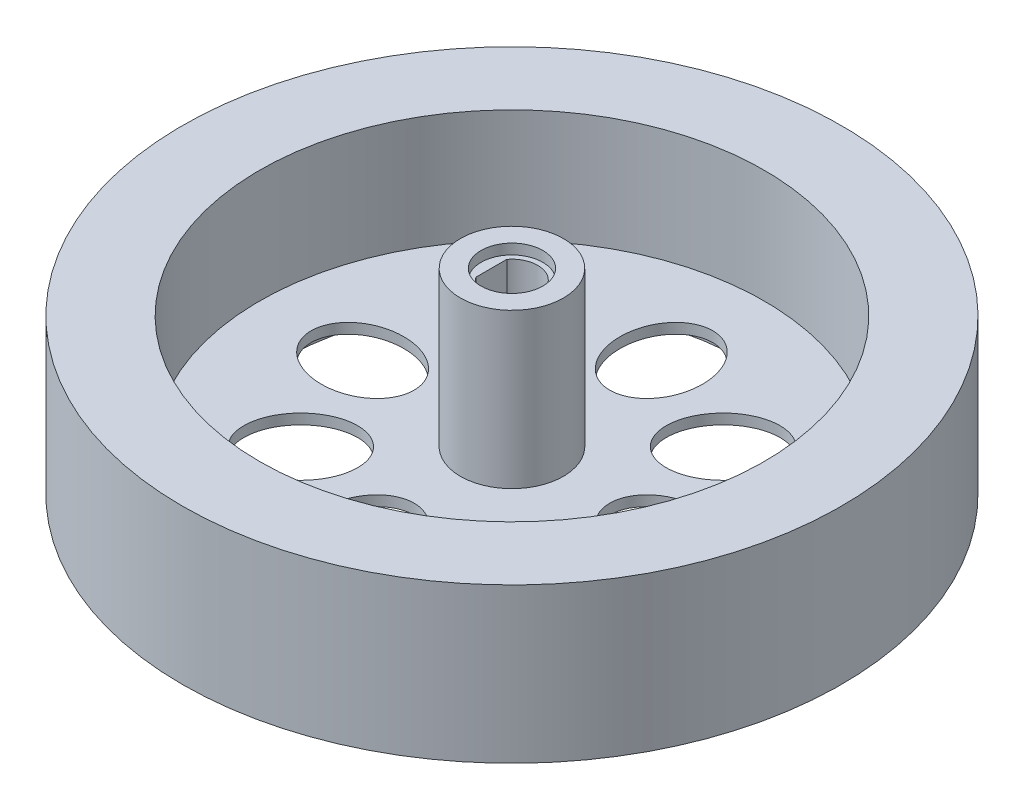
ISO-10303-21;
HEADER;
FILE_DESCRIPTION(('STEP AP214'),'2;1');
FILE_NAME('part.step','',(''),(''),'','','');
FILE_SCHEMA(('AUTOMOTIVE_DESIGN { 1 0 10303 214 1 1 1 1 }'));
ENDSEC;
DATA;
#1=APPLICATION_CONTEXT('core data for automotive mechanical design processes');
#2=APPLICATION_PROTOCOL_DEFINITION('international standard','automotive_design',2000,#1);
#3=PRODUCT_CONTEXT('',#1,'mechanical');
#4=PRODUCT('Part','Part','',(#3));
#5=PRODUCT_RELATED_PRODUCT_CATEGORY('part','',(#4));
#6=PRODUCT_DEFINITION_FORMATION('','',#4);
#7=PRODUCT_DEFINITION_CONTEXT('part definition',#1,'design');
#8=PRODUCT_DEFINITION('design','',#6,#7);
#9=PRODUCT_DEFINITION_SHAPE('','',#8);
#10=(LENGTH_UNIT() NAMED_UNIT(*) SI_UNIT(.MILLI.,.METRE.));
#11=(NAMED_UNIT(*) PLANE_ANGLE_UNIT() SI_UNIT($,.RADIAN.));
#12=(NAMED_UNIT(*) SI_UNIT($,.STERADIAN.) SOLID_ANGLE_UNIT());
#13=UNCERTAINTY_MEASURE_WITH_UNIT(LENGTH_MEASURE(1.E-05),#10,'distance_accuracy_value','');
#14=(GEOMETRIC_REPRESENTATION_CONTEXT(3) GLOBAL_UNCERTAINTY_ASSIGNED_CONTEXT((#13)) GLOBAL_UNIT_ASSIGNED_CONTEXT((#10,
#11,#12)) REPRESENTATION_CONTEXT('',''));
#15=CARTESIAN_POINT('',(0.,0.,0.));
#16=DIRECTION('',(0.,0.,1.));
#17=DIRECTION('',(1.,0.,0.));
#18=AXIS2_PLACEMENT_3D('',#15,#16,#17);
#19=CARTESIAN_POINT('',(0.,15.,0.));
#20=DIRECTION('',(0.,-1.,0.));
#21=DIRECTION('',(0.,0.,-1.));
#22=AXIS2_PLACEMENT_3D('',#19,#20,#21);
#23=CYLINDRICAL_SURFACE('',#22,32.);
#24=CARTESIAN_POINT('',(0.,15.,0.));
#25=DIRECTION('',(0.,1.,0.));
#26=DIRECTION('',(0.,0.,1.));
#27=AXIS2_PLACEMENT_3D('',#24,#25,#26);
#28=CIRCLE('',#27,32.);
#29=CARTESIAN_POINT('',(0.,15.,32.));
#30=VERTEX_POINT('',#29);
#31=EDGE_CURVE('E11',#30,#30,#28,.T.);
#32=ORIENTED_EDGE('',*,*,#31,.F.);
#33=EDGE_LOOP('',(#32));
#34=FACE_BOUND('',#33,.T.);
#35=CARTESIAN_POINT('',(0.,0.,0.));
#36=DIRECTION('',(0.,1.,0.));
#37=DIRECTION('',(0.,0.,1.));
#38=AXIS2_PLACEMENT_3D('',#35,#36,#37);
#39=CIRCLE('',#38,32.);
#40=CARTESIAN_POINT('',(0.,0.,32.));
#41=VERTEX_POINT('',#40);
#42=EDGE_CURVE('E38',#41,#41,#39,.T.);
#43=ORIENTED_EDGE('',*,*,#42,.T.);
#44=EDGE_LOOP('',(#43));
#45=FACE_BOUND('',#44,.T.);
#46=ADVANCED_FACE('F35',(#34,#45),#23,.T.);
#47=CARTESIAN_POINT('',(0.,15.,0.));
#48=DIRECTION('',(0.,1.,0.));
#49=DIRECTION('',(0.,0.,1.));
#50=AXIS2_PLACEMENT_3D('',#47,#48,#49);
#51=PLANE('',#50);
#52=CARTESIAN_POINT('',(0.,15.,0.));
#53=DIRECTION('',(0.,1.,0.));
#54=DIRECTION('',(0.,0.,1.));
#55=AXIS2_PLACEMENT_3D('',#52,#53,#54);
#56=CIRCLE('',#55,24.5);
#57=CARTESIAN_POINT('',(0.,15.,24.5));
#58=VERTEX_POINT('',#57);
#59=EDGE_CURVE('E216',#58,#58,#56,.T.);
#60=ORIENTED_EDGE('',*,*,#59,.F.);
#61=EDGE_LOOP('',(#60));
#62=FACE_BOUND('',#61,.T.);
#63=ORIENTED_EDGE('',*,*,#31,.T.);
#64=EDGE_LOOP('',(#63));
#65=FACE_BOUND('',#64,.T.);
#66=ADVANCED_FACE('F242',(#62,#65),#51,.T.);
#67=CARTESIAN_POINT('',(0.,0.,0.));
#68=DIRECTION('',(0.,1.,0.));
#69=DIRECTION('',(0.,0.,1.));
#70=AXIS2_PLACEMENT_3D('',#67,#68,#69);
#71=PLANE('',#70);
#72=CARTESIAN_POINT('',(0.,0.,0.));
#73=DIRECTION('',(0.,-1.,0.));
#74=DIRECTION('',(0.,0.,-1.));
#75=AXIS2_PLACEMENT_3D('',#72,#73,#74);
#76=CIRCLE('',#75,22.5);
#77=CARTESIAN_POINT('',(0.,0.,-22.5));
#78=VERTEX_POINT('',#77);
#79=EDGE_CURVE('E228',#78,#78,#76,.T.);
#80=ORIENTED_EDGE('',*,*,#79,.F.);
#81=EDGE_LOOP('',(#80));
#82=FACE_BOUND('',#81,.T.);
#83=ORIENTED_EDGE('',*,*,#42,.F.);
#84=EDGE_LOOP('',(#83));
#85=FACE_BOUND('',#84,.T.);
#86=ADVANCED_FACE('F239',(#82,#85),#71,.F.);
#87=CARTESIAN_POINT('',(0.,3.,0.));
#88=DIRECTION('',(0.,-1.,0.));
#89=DIRECTION('',(0.,0.,-1.));
#90=AXIS2_PLACEMENT_3D('',#87,#88,#89);
#91=CYLINDRICAL_SURFACE('',#90,22.5);
#92=CARTESIAN_POINT('',(0.,3.,0.));
#93=DIRECTION('',(0.,-1.,0.));
#94=DIRECTION('',(0.,0.,-1.));
#95=AXIS2_PLACEMENT_3D('',#92,#93,#94);
#96=CIRCLE('',#95,22.5);
#97=CARTESIAN_POINT('',(0.,3.,-22.5));
#98=VERTEX_POINT('',#97);
#99=EDGE_CURVE('E231',#98,#98,#96,.T.);
#100=ORIENTED_EDGE('',*,*,#99,.F.);
#101=EDGE_LOOP('',(#100));
#102=FACE_BOUND('',#101,.T.);
#103=ORIENTED_EDGE('',*,*,#79,.T.);
#104=EDGE_LOOP('',(#103));
#105=FACE_BOUND('',#104,.T.);
#106=ADVANCED_FACE('F237',(#102,#105),#91,.F.);
#107=CARTESIAN_POINT('',(0.,3.,0.));
#108=DIRECTION('',(0.,-1.,0.));
#109=DIRECTION('',(0.,0.,-1.));
#110=AXIS2_PLACEMENT_3D('',#107,#108,#109);
#111=PLANE('',#110);
#112=CARTESIAN_POINT('',(10.2530483272048,3.,10.2530483272051));
#113=DIRECTION('',(0.,1.,0.));
#114=DIRECTION('',(0.707106781186539,0.,0.707106781186556));
#115=AXIS2_PLACEMENT_3D('',#112,#113,#114);
#116=ELLIPSE('',#115,5.,4.);
#117=CARTESIAN_POINT('',(13.7885822331375,3.,13.7885822331378));
#118=VERTEX_POINT('',#117);
#119=EDGE_CURVE('E209',#118,#118,#116,.F.);
#120=ORIENTED_EDGE('',*,*,#119,.F.);
#121=EDGE_LOOP('',(#120));
#122=FACE_BOUND('',#121,.T.);
#123=CARTESIAN_POINT('',(14.5,3.,1.53693790834952E-13));
#124=DIRECTION('',(0.,1.,0.));
#125=DIRECTION('',(1.,0.,0.));
#126=AXIS2_PLACEMENT_3D('',#123,#124,#125);
#127=ELLIPSE('',#126,5.,4.);
#128=CARTESIAN_POINT('',(19.5,3.,2.06678334317172E-13));
#129=VERTEX_POINT('',#128);
#130=EDGE_CURVE('E206',#129,#129,#127,.F.);
#131=ORIENTED_EDGE('',*,*,#130,.F.);
#132=EDGE_LOOP('',(#131));
#133=FACE_BOUND('',#132,.T.);
#134=CARTESIAN_POINT('',(10.253048327205,3.,-10.2530483272049));
#135=DIRECTION('',(0.,1.,0.));
#136=DIRECTION('',(0.707106781186554,0.,-0.707106781186541));
#137=AXIS2_PLACEMENT_3D('',#134,#135,#136);
#138=ELLIPSE('',#137,5.,4.);
#139=CARTESIAN_POINT('',(13.7885822331378,3.,-13.7885822331376));
#140=VERTEX_POINT('',#139);
#141=EDGE_CURVE('E203',#140,#140,#138,.F.);
#142=ORIENTED_EDGE('',*,*,#141,.F.);
#143=EDGE_LOOP('',(#142));
#144=FACE_BOUND('',#143,.T.);
#145=CARTESIAN_POINT('',(1.03067311421726E-13,3.,-14.5));
#146=DIRECTION('',(0.,1.,0.));
#147=DIRECTION('',(0.,0.,-1.));
#148=AXIS2_PLACEMENT_3D('',#145,#146,#147);
#149=ELLIPSE('',#148,5.,4.);
#150=CARTESIAN_POINT('',(1.38594448209731E-13,3.,-19.5));
#151=VERTEX_POINT('',#150);
#152=EDGE_CURVE('E200',#151,#151,#149,.F.);
#153=ORIENTED_EDGE('',*,*,#152,.F.);
#154=EDGE_LOOP('',(#153));
#155=FACE_BOUND('',#154,.T.);
#156=CARTESIAN_POINT('',(-10.2530483272049,3.,-10.253048327205));
#157=DIRECTION('',(0.,1.,0.));
#158=DIRECTION('',(-0.707106781186544,0.,-0.707106781186551));
#159=AXIS2_PLACEMENT_3D('',#156,#157,#158);
#160=ELLIPSE('',#159,5.,4.);
#161=CARTESIAN_POINT('',(-13.7885822331376,3.,-13.7885822331377));
#162=VERTEX_POINT('',#161);
#163=EDGE_CURVE('E197',#162,#162,#160,.F.);
#164=ORIENTED_EDGE('',*,*,#163,.F.);
#165=EDGE_LOOP('',(#164));
#166=FACE_BOUND('',#165,.T.);
#167=CARTESIAN_POINT('',(-14.5,3.,0.));
#168=DIRECTION('',(0.,1.,0.));
#169=DIRECTION('',(-1.,0.,0.));
#170=AXIS2_PLACEMENT_3D('',#167,#168,#169);
#171=ELLIPSE('',#170,5.,4.);
#172=CARTESIAN_POINT('',(-19.5,3.,0.));
#173=VERTEX_POINT('',#172);
#174=EDGE_CURVE('E194',#173,#173,#171,.F.);
#175=ORIENTED_EDGE('',*,*,#174,.F.);
#176=EDGE_LOOP('',(#175));
#177=FACE_BOUND('',#176,.T.);
#178=CARTESIAN_POINT('',(-10.253048327205,3.,10.2530483272049));
#179=DIRECTION('',(0.,1.,0.));
#180=DIRECTION('',(-0.707106781186549,0.,0.707106781186546));
#181=AXIS2_PLACEMENT_3D('',#178,#179,#180);
#182=ELLIPSE('',#181,5.,4.);
#183=CARTESIAN_POINT('',(-13.7885822331377,3.,13.7885822331377));
#184=VERTEX_POINT('',#183);
#185=EDGE_CURVE('E191',#184,#184,#182,.F.);
#186=ORIENTED_EDGE('',*,*,#185,.F.);
#187=EDGE_LOOP('',(#186));
#188=FACE_BOUND('',#187,.T.);
#189=CARTESIAN_POINT('',(0.,3.,14.5));
#190=DIRECTION('',(0.,1.,0.));
#191=DIRECTION('',(0.,0.,1.));
#192=AXIS2_PLACEMENT_3D('',#189,#190,#191);
#193=ELLIPSE('',#192,5.,4.);
#194=CARTESIAN_POINT('',(0.,3.,19.5));
#195=VERTEX_POINT('',#194);
#196=EDGE_CURVE('E188',#195,#195,#193,.F.);
#197=ORIENTED_EDGE('',*,*,#196,.F.);
#198=EDGE_LOOP('',(#197));
#199=FACE_BOUND('',#198,.T.);
#200=CARTESIAN_POINT('',(0.,3.,0.));
#201=DIRECTION('',(0.,-1.,0.));
#202=DIRECTION('',(0.,0.,-1.));
#203=AXIS2_PLACEMENT_3D('',#200,#201,#202);
#204=CIRCLE('',#203,7.5);
#205=CARTESIAN_POINT('',(0.,3.,-7.5));
#206=VERTEX_POINT('',#205);
#207=EDGE_CURVE('E222',#206,#206,#204,.T.);
#208=ORIENTED_EDGE('',*,*,#207,.F.);
#209=EDGE_LOOP('',(#208));
#210=FACE_BOUND('',#209,.T.);
#211=ORIENTED_EDGE('',*,*,#99,.T.);
#212=EDGE_LOOP('',(#211));
#213=FACE_BOUND('',#212,.T.);
#214=ADVANCED_FACE('F261',(#122,#133,#144,#155,#166,#177,#188,#199,#210,#213),#111,.T.);
#215=CARTESIAN_POINT('',(0.,1.,0.));
#216=DIRECTION('',(0.,1.,0.));
#217=DIRECTION('',(0.,0.,1.));
#218=AXIS2_PLACEMENT_3D('',#215,#216,#217);
#219=CYLINDRICAL_SURFACE('',#218,7.5);
#220=CARTESIAN_POINT('',(0.,1.,0.));
#221=DIRECTION('',(0.,-1.,0.));
#222=DIRECTION('',(0.,0.,-1.));
#223=AXIS2_PLACEMENT_3D('',#220,#221,#222);
#224=CIRCLE('',#223,7.5);
#225=CARTESIAN_POINT('',(0.,1.,-7.5));
#226=VERTEX_POINT('',#225);
#227=EDGE_CURVE('E225',#226,#226,#224,.T.);
#228=ORIENTED_EDGE('',*,*,#227,.F.);
#229=EDGE_LOOP('',(#228));
#230=FACE_BOUND('',#229,.T.);
#231=ORIENTED_EDGE('',*,*,#207,.T.);
#232=EDGE_LOOP('',(#231));
#233=FACE_BOUND('',#232,.T.);
#234=ADVANCED_FACE('F265',(#230,#233),#219,.T.);
#235=CARTESIAN_POINT('',(0.,1.,0.));
#236=DIRECTION('',(0.,-1.,0.));
#237=DIRECTION('',(0.,0.,-1.));
#238=AXIS2_PLACEMENT_3D('',#235,#236,#237);
#239=PLANE('',#238);
#240=ORIENTED_EDGE('',*,*,#227,.T.);
#241=EDGE_LOOP('',(#240));
#242=FACE_BOUND('',#241,.T.);
#243=ADVANCED_FACE('F269',(#242),#239,.T.);
#244=CARTESIAN_POINT('',(0.,4.,0.));
#245=DIRECTION('',(0.,1.,0.));
#246=DIRECTION('',(0.,0.,1.));
#247=AXIS2_PLACEMENT_3D('',#244,#245,#246);
#248=CYLINDRICAL_SURFACE('',#247,24.5);
#249=CARTESIAN_POINT('',(0.,4.,0.));
#250=DIRECTION('',(0.,1.,0.));
#251=DIRECTION('',(0.,0.,1.));
#252=AXIS2_PLACEMENT_3D('',#249,#250,#251);
#253=CIRCLE('',#252,24.5);
#254=CARTESIAN_POINT('',(0.,4.,24.5));
#255=VERTEX_POINT('',#254);
#256=EDGE_CURVE('E219',#255,#255,#253,.T.);
#257=ORIENTED_EDGE('',*,*,#256,.F.);
#258=EDGE_LOOP('',(#257));
#259=FACE_BOUND('',#258,.T.);
#260=ORIENTED_EDGE('',*,*,#59,.T.);
#261=EDGE_LOOP('',(#260));
#262=FACE_BOUND('',#261,.T.);
#263=ADVANCED_FACE('F273',(#259,#262),#248,.F.);
#264=CARTESIAN_POINT('',(0.,4.,0.));
#265=DIRECTION('',(0.,1.,0.));
#266=DIRECTION('',(0.,0.,1.));
#267=AXIS2_PLACEMENT_3D('',#264,#265,#266);
#268=PLANE('',#267);
#269=CARTESIAN_POINT('',(10.2530483272048,4.,10.2530483272051));
#270=DIRECTION('',(0.,1.,0.));
#271=DIRECTION('',(0.707106781186539,0.,0.707106781186556));
#272=AXIS2_PLACEMENT_3D('',#269,#270,#271);
#273=ELLIPSE('',#272,5.,4.);
#274=CARTESIAN_POINT('',(13.7885822331375,4.,13.7885822331378));
#275=VERTEX_POINT('',#274);
#276=EDGE_CURVE('E115',#275,#275,#273,.T.);
#277=ORIENTED_EDGE('',*,*,#276,.F.);
#278=EDGE_LOOP('',(#277));
#279=FACE_BOUND('',#278,.T.);
#280=CARTESIAN_POINT('',(14.5,4.,1.53693790834952E-13));
#281=DIRECTION('',(0.,1.,0.));
#282=DIRECTION('',(1.,0.,0.));
#283=AXIS2_PLACEMENT_3D('',#280,#281,#282);
#284=ELLIPSE('',#283,5.,4.);
#285=CARTESIAN_POINT('',(19.5,4.,2.06678334317172E-13));
#286=VERTEX_POINT('',#285);
#287=EDGE_CURVE('E166',#286,#286,#284,.T.);
#288=ORIENTED_EDGE('',*,*,#287,.F.);
#289=EDGE_LOOP('',(#288));
#290=FACE_BOUND('',#289,.T.);
#291=CARTESIAN_POINT('',(10.253048327205,4.,-10.2530483272049));
#292=DIRECTION('',(0.,1.,0.));
#293=DIRECTION('',(0.707106781186554,0.,-0.707106781186541));
#294=AXIS2_PLACEMENT_3D('',#291,#292,#293);
#295=ELLIPSE('',#294,5.,4.);
#296=CARTESIAN_POINT('',(13.7885822331378,4.,-13.7885822331376));
#297=VERTEX_POINT('',#296);
#298=EDGE_CURVE('E164',#297,#297,#295,.T.);
#299=ORIENTED_EDGE('',*,*,#298,.F.);
#300=EDGE_LOOP('',(#299));
#301=FACE_BOUND('',#300,.T.);
#302=CARTESIAN_POINT('',(1.03067311421726E-13,4.,-14.5));
#303=DIRECTION('',(0.,1.,0.));
#304=DIRECTION('',(0.,0.,-1.));
#305=AXIS2_PLACEMENT_3D('',#302,#303,#304);
#306=ELLIPSE('',#305,5.,4.);
#307=CARTESIAN_POINT('',(1.38594448209731E-13,4.,-19.5));
#308=VERTEX_POINT('',#307);
#309=EDGE_CURVE('E147',#308,#308,#306,.T.);
#310=ORIENTED_EDGE('',*,*,#309,.F.);
#311=EDGE_LOOP('',(#310));
#312=FACE_BOUND('',#311,.T.);
#313=CARTESIAN_POINT('',(-10.2530483272049,4.,-10.253048327205));
#314=DIRECTION('',(0.,1.,0.));
#315=DIRECTION('',(-0.707106781186544,0.,-0.707106781186551));
#316=AXIS2_PLACEMENT_3D('',#313,#314,#315);
#317=ELLIPSE('',#316,5.,4.);
#318=CARTESIAN_POINT('',(-13.7885822331376,4.,-13.7885822331377));
#319=VERTEX_POINT('',#318);
#320=EDGE_CURVE('E142',#319,#319,#317,.T.);
#321=ORIENTED_EDGE('',*,*,#320,.F.);
#322=EDGE_LOOP('',(#321));
#323=FACE_BOUND('',#322,.T.);
#324=CARTESIAN_POINT('',(-14.5,4.,0.));
#325=DIRECTION('',(0.,1.,0.));
#326=DIRECTION('',(-1.,0.,0.));
#327=AXIS2_PLACEMENT_3D('',#324,#325,#326);
#328=ELLIPSE('',#327,5.,4.);
#329=CARTESIAN_POINT('',(-19.5,4.,0.));
#330=VERTEX_POINT('',#329);
#331=EDGE_CURVE('E140',#330,#330,#328,.T.);
#332=ORIENTED_EDGE('',*,*,#331,.F.);
#333=EDGE_LOOP('',(#332));
#334=FACE_BOUND('',#333,.T.);
#335=CARTESIAN_POINT('',(-10.253048327205,4.,10.2530483272049));
#336=DIRECTION('',(0.,1.,0.));
#337=DIRECTION('',(-0.707106781186549,0.,0.707106781186546));
#338=AXIS2_PLACEMENT_3D('',#335,#336,#337);
#339=ELLIPSE('',#338,5.,4.);
#340=CARTESIAN_POINT('',(-13.7885822331377,4.,13.7885822331377));
#341=VERTEX_POINT('',#340);
#342=EDGE_CURVE('E120',#341,#341,#339,.T.);
#343=ORIENTED_EDGE('',*,*,#342,.F.);
#344=EDGE_LOOP('',(#343));
#345=FACE_BOUND('',#344,.T.);
#346=CARTESIAN_POINT('',(0.,4.,14.5));
#347=DIRECTION('',(0.,1.,0.));
#348=DIRECTION('',(0.,0.,1.));
#349=AXIS2_PLACEMENT_3D('',#346,#347,#348);
#350=ELLIPSE('',#349,5.,4.);
#351=CARTESIAN_POINT('',(0.,4.,19.5));
#352=VERTEX_POINT('',#351);
#353=EDGE_CURVE('E185',#352,#352,#350,.T.);
#354=ORIENTED_EDGE('',*,*,#353,.F.);
#355=EDGE_LOOP('',(#354));
#356=FACE_BOUND('',#355,.T.);
#357=CARTESIAN_POINT('',(0.,4.,0.));
#358=DIRECTION('',(0.,1.,0.));
#359=DIRECTION('',(0.,0.,1.));
#360=AXIS2_PLACEMENT_3D('',#357,#358,#359);
#361=CIRCLE('',#360,5.);
#362=CARTESIAN_POINT('',(0.,4.,5.));
#363=VERTEX_POINT('',#362);
#364=EDGE_CURVE('E212',#363,#363,#361,.T.);
#365=ORIENTED_EDGE('',*,*,#364,.F.);
#366=EDGE_LOOP('',(#365));
#367=FACE_BOUND('',#366,.T.);
#368=ORIENTED_EDGE('',*,*,#256,.T.);
#369=EDGE_LOOP('',(#368));
#370=FACE_BOUND('',#369,.T.);
#371=ADVANCED_FACE('F277',(#279,#290,#301,#312,#323,#334,#345,#356,#367,#370),#268,.T.);
#372=CARTESIAN_POINT('',(0.,19.,0.));
#373=DIRECTION('',(0.,-1.,0.));
#374=DIRECTION('',(0.,0.,-1.));
#375=AXIS2_PLACEMENT_3D('',#372,#373,#374);
#376=CYLINDRICAL_SURFACE('',#375,5.);
#377=CARTESIAN_POINT('',(0.,19.,0.));
#378=DIRECTION('',(0.,1.,0.));
#379=DIRECTION('',(0.,0.,1.));
#380=AXIS2_PLACEMENT_3D('',#377,#378,#379);
#381=CIRCLE('',#380,5.);
#382=CARTESIAN_POINT('',(0.,19.,5.));
#383=VERTEX_POINT('',#382);
#384=EDGE_CURVE('E213',#383,#383,#381,.T.);
#385=ORIENTED_EDGE('',*,*,#384,.F.);
#386=EDGE_LOOP('',(#385));
#387=FACE_BOUND('',#386,.T.);
#388=ORIENTED_EDGE('',*,*,#364,.T.);
#389=EDGE_LOOP('',(#388));
#390=FACE_BOUND('',#389,.T.);
#391=ADVANCED_FACE('F280',(#387,#390),#376,.T.);
#392=CARTESIAN_POINT('',(0.,19.,0.));
#393=DIRECTION('',(0.,1.,0.));
#394=DIRECTION('',(0.,0.,1.));
#395=AXIS2_PLACEMENT_3D('',#392,#393,#394);
#396=PLANE('',#395);
#397=CARTESIAN_POINT('',(0.,19.,0.));
#398=DIRECTION('',(0.,1.,0.));
#399=DIRECTION('',(0.,0.,1.));
#400=AXIS2_PLACEMENT_3D('',#397,#398,#399);
#401=CIRCLE('',#400,3.);
#402=CARTESIAN_POINT('',(0.,19.,3.));
#403=VERTEX_POINT('',#402);
#404=EDGE_CURVE('E109',#403,#403,#401,.T.);
#405=ORIENTED_EDGE('',*,*,#404,.F.);
#406=EDGE_LOOP('',(#405));
#407=FACE_BOUND('',#406,.T.);
#408=ORIENTED_EDGE('',*,*,#384,.T.);
#409=EDGE_LOOP('',(#408));
#410=FACE_BOUND('',#409,.T.);
#411=ADVANCED_FACE('F180',(#407,#410),#396,.T.);
#412=CARTESIAN_POINT('',(0.,0.,14.5));
#413=DIRECTION('',(0.,1.,0.));
#414=DIRECTION('',(0.,0.,1.));
#415=AXIS2_PLACEMENT_3D('',#412,#413,#414);
#416=ELLIPSE('',#415,5.,4.);
#417=DIRECTION('',(0.,1.,0.));
#418=VECTOR('',#417,1.);
#419=SURFACE_OF_LINEAR_EXTRUSION('',#416,#418);
#420=ORIENTED_EDGE('',*,*,#196,.T.);
#421=EDGE_LOOP('',(#420));
#422=FACE_BOUND('',#421,.T.);
#423=ORIENTED_EDGE('',*,*,#353,.T.);
#424=EDGE_LOOP('',(#423));
#425=FACE_BOUND('',#424,.T.);
#426=ADVANCED_FACE('F128',(#422,#425),#419,.F.);
#427=CARTESIAN_POINT('',(-10.253048327205,0.,10.2530483272049));
#428=DIRECTION('',(0.,1.,0.));
#429=DIRECTION('',(-0.707106781186549,0.,0.707106781186546));
#430=AXIS2_PLACEMENT_3D('',#427,#428,#429);
#431=ELLIPSE('',#430,5.,4.);
#432=DIRECTION('',(0.,1.,0.));
#433=VECTOR('',#432,1.);
#434=SURFACE_OF_LINEAR_EXTRUSION('',#431,#433);
#435=ORIENTED_EDGE('',*,*,#185,.T.);
#436=EDGE_LOOP('',(#435));
#437=FACE_BOUND('',#436,.T.);
#438=ORIENTED_EDGE('',*,*,#342,.T.);
#439=EDGE_LOOP('',(#438));
#440=FACE_BOUND('',#439,.T.);
#441=ADVANCED_FACE('F123',(#437,#440),#434,.F.);
#442=CARTESIAN_POINT('',(-14.5,0.,0.));
#443=DIRECTION('',(0.,1.,0.));
#444=DIRECTION('',(-1.,0.,0.));
#445=AXIS2_PLACEMENT_3D('',#442,#443,#444);
#446=ELLIPSE('',#445,5.,4.);
#447=DIRECTION('',(0.,1.,0.));
#448=VECTOR('',#447,1.);
#449=SURFACE_OF_LINEAR_EXTRUSION('',#446,#448);
#450=ORIENTED_EDGE('',*,*,#174,.T.);
#451=EDGE_LOOP('',(#450));
#452=FACE_BOUND('',#451,.T.);
#453=ORIENTED_EDGE('',*,*,#331,.T.);
#454=EDGE_LOOP('',(#453));
#455=FACE_BOUND('',#454,.T.);
#456=ADVANCED_FACE('F127',(#452,#455),#449,.F.);
#457=CARTESIAN_POINT('',(-10.2530483272049,0.,-10.253048327205));
#458=DIRECTION('',(0.,1.,0.));
#459=DIRECTION('',(-0.707106781186544,0.,-0.707106781186551));
#460=AXIS2_PLACEMENT_3D('',#457,#458,#459);
#461=ELLIPSE('',#460,5.,4.);
#462=DIRECTION('',(0.,1.,0.));
#463=VECTOR('',#462,1.);
#464=SURFACE_OF_LINEAR_EXTRUSION('',#461,#463);
#465=ORIENTED_EDGE('',*,*,#163,.T.);
#466=EDGE_LOOP('',(#465));
#467=FACE_BOUND('',#466,.T.);
#468=ORIENTED_EDGE('',*,*,#320,.T.);
#469=EDGE_LOOP('',(#468));
#470=FACE_BOUND('',#469,.T.);
#471=ADVANCED_FACE('F134',(#467,#470),#464,.F.);
#472=CARTESIAN_POINT('',(1.03067311421726E-13,0.,-14.5));
#473=DIRECTION('',(0.,1.,0.));
#474=DIRECTION('',(0.,0.,-1.));
#475=AXIS2_PLACEMENT_3D('',#472,#473,#474);
#476=ELLIPSE('',#475,5.,4.);
#477=DIRECTION('',(0.,1.,0.));
#478=VECTOR('',#477,1.);
#479=SURFACE_OF_LINEAR_EXTRUSION('',#476,#478);
#480=ORIENTED_EDGE('',*,*,#152,.T.);
#481=EDGE_LOOP('',(#480));
#482=FACE_BOUND('',#481,.T.);
#483=ORIENTED_EDGE('',*,*,#309,.T.);
#484=EDGE_LOOP('',(#483));
#485=FACE_BOUND('',#484,.T.);
#486=ADVANCED_FACE('F151',(#482,#485),#479,.F.);
#487=CARTESIAN_POINT('',(10.253048327205,0.,-10.2530483272049));
#488=DIRECTION('',(0.,1.,0.));
#489=DIRECTION('',(0.707106781186554,0.,-0.707106781186541));
#490=AXIS2_PLACEMENT_3D('',#487,#488,#489);
#491=ELLIPSE('',#490,5.,4.);
#492=DIRECTION('',(0.,1.,0.));
#493=VECTOR('',#492,1.);
#494=SURFACE_OF_LINEAR_EXTRUSION('',#491,#493);
#495=ORIENTED_EDGE('',*,*,#141,.T.);
#496=EDGE_LOOP('',(#495));
#497=FACE_BOUND('',#496,.T.);
#498=ORIENTED_EDGE('',*,*,#298,.T.);
#499=EDGE_LOOP('',(#498));
#500=FACE_BOUND('',#499,.T.);
#501=ADVANCED_FACE('F154',(#497,#500),#494,.F.);
#502=CARTESIAN_POINT('',(14.5,0.,1.53693790834952E-13));
#503=DIRECTION('',(0.,1.,0.));
#504=DIRECTION('',(1.,0.,0.));
#505=AXIS2_PLACEMENT_3D('',#502,#503,#504);
#506=ELLIPSE('',#505,5.,4.);
#507=DIRECTION('',(0.,1.,0.));
#508=VECTOR('',#507,1.);
#509=SURFACE_OF_LINEAR_EXTRUSION('',#506,#508);
#510=ORIENTED_EDGE('',*,*,#130,.T.);
#511=EDGE_LOOP('',(#510));
#512=FACE_BOUND('',#511,.T.);
#513=ORIENTED_EDGE('',*,*,#287,.T.);
#514=EDGE_LOOP('',(#513));
#515=FACE_BOUND('',#514,.T.);
#516=ADVANCED_FACE('F158',(#512,#515),#509,.F.);
#517=CARTESIAN_POINT('',(10.2530483272048,0.,10.2530483272051));
#518=DIRECTION('',(0.,1.,0.));
#519=DIRECTION('',(0.707106781186539,0.,0.707106781186556));
#520=AXIS2_PLACEMENT_3D('',#517,#518,#519);
#521=ELLIPSE('',#520,5.,4.);
#522=DIRECTION('',(0.,1.,0.));
#523=VECTOR('',#522,1.);
#524=SURFACE_OF_LINEAR_EXTRUSION('',#521,#523);
#525=ORIENTED_EDGE('',*,*,#119,.T.);
#526=EDGE_LOOP('',(#525));
#527=FACE_BOUND('',#526,.T.);
#528=ORIENTED_EDGE('',*,*,#276,.T.);
#529=EDGE_LOOP('',(#528));
#530=FACE_BOUND('',#529,.T.);
#531=ADVANCED_FACE('F174',(#527,#530),#524,.F.);
#532=CARTESIAN_POINT('',(0.,18.,0.));
#533=DIRECTION('',(0.,1.,0.));
#534=DIRECTION('',(0.,0.,1.));
#535=AXIS2_PLACEMENT_3D('',#532,#533,#534);
#536=CYLINDRICAL_SURFACE('',#535,3.);
#537=CARTESIAN_POINT('',(0.,18.,0.));
#538=DIRECTION('',(0.,1.,0.));
#539=DIRECTION('',(0.,0.,1.));
#540=AXIS2_PLACEMENT_3D('',#537,#538,#539);
#541=CIRCLE('',#540,3.);
#542=CARTESIAN_POINT('',(0.,18.,3.));
#543=VERTEX_POINT('',#542);
#544=EDGE_CURVE('E112',#543,#543,#541,.T.);
#545=ORIENTED_EDGE('',*,*,#544,.F.);
#546=EDGE_LOOP('',(#545));
#547=FACE_BOUND('',#546,.T.);
#548=ORIENTED_EDGE('',*,*,#404,.T.);
#549=EDGE_LOOP('',(#548));
#550=FACE_BOUND('',#549,.T.);
#551=ADVANCED_FACE('F130',(#547,#550),#536,.F.);
#552=CARTESIAN_POINT('',(0.,18.,0.));
#553=DIRECTION('',(0.,1.,0.));
#554=DIRECTION('',(0.,0.,1.));
#555=AXIS2_PLACEMENT_3D('',#552,#553,#554);
#556=PLANE('',#555);
#557=CARTESIAN_POINT('',(0.,18.,0.));
#558=DIRECTION('',(0.,1.,0.));
#559=DIRECTION('',(0.,0.,1.));
#560=AXIS2_PLACEMENT_3D('',#557,#558,#559);
#561=CIRCLE('',#560,2.5);
#562=CARTESIAN_POINT('',(-2.,18.,1.5));
#563=VERTEX_POINT('',#562);
#564=CARTESIAN_POINT('',(2.,18.,1.5));
#565=VERTEX_POINT('',#564);
#566=EDGE_CURVE('E103',#563,#565,#561,.T.);
#567=ORIENTED_EDGE('',*,*,#566,.F.);
#568=DIRECTION('',(0.,0.,1.));
#569=VECTOR('',#568,1.);
#570=CARTESIAN_POINT('',(-2.,18.,1.5));
#571=LINE('',#570,#569);
#572=CARTESIAN_POINT('',(-2.,18.,-1.5));
#573=VERTEX_POINT('',#572);
#574=EDGE_CURVE('E99',#573,#563,#571,.T.);
#575=ORIENTED_EDGE('',*,*,#574,.F.);
#576=CARTESIAN_POINT('',(0.,18.,0.));
#577=DIRECTION('',(0.,1.,0.));
#578=DIRECTION('',(0.,0.,1.));
#579=AXIS2_PLACEMENT_3D('',#576,#577,#578);
#580=CIRCLE('',#579,2.5);
#581=CARTESIAN_POINT('',(2.,18.,-1.5));
#582=VERTEX_POINT('',#581);
#583=EDGE_CURVE('E49',#582,#573,#580,.T.);
#584=ORIENTED_EDGE('',*,*,#583,.F.);
#585=DIRECTION('',(0.,0.,-1.));
#586=VECTOR('',#585,1.);
#587=CARTESIAN_POINT('',(2.,18.,1.5));
#588=LINE('',#587,#586);
#589=EDGE_CURVE('E86',#565,#582,#588,.T.);
#590=ORIENTED_EDGE('',*,*,#589,.F.);
#591=EDGE_LOOP('',(#567,#575,#584,#590));
#592=FACE_BOUND('',#591,.T.);
#593=ORIENTED_EDGE('',*,*,#544,.T.);
#594=EDGE_LOOP('',(#593));
#595=FACE_BOUND('',#594,.T.);
#596=ADVANCED_FACE('F301',(#592,#595),#556,.T.);
#597=CARTESIAN_POINT('',(0.,11.,0.));
#598=DIRECTION('',(0.,1.,0.));
#599=DIRECTION('',(0.,0.,1.));
#600=AXIS2_PLACEMENT_3D('',#597,#598,#599);
#601=CYLINDRICAL_SURFACE('',#600,2.5);
#602=ORIENTED_EDGE('',*,*,#566,.T.);
#603=DIRECTION('',(0.,1.,0.));
#604=VECTOR('',#603,1.);
#605=CARTESIAN_POINT('',(2.,11.,1.5));
#606=LINE('',#605,#604);
#607=CARTESIAN_POINT('',(2.,11.,1.5));
#608=VERTEX_POINT('',#607);
#609=EDGE_CURVE('E74',#608,#565,#606,.T.);
#610=ORIENTED_EDGE('',*,*,#609,.F.);
#611=CARTESIAN_POINT('',(0.,11.,0.));
#612=DIRECTION('',(0.,1.,0.));
#613=DIRECTION('',(0.,0.,1.));
#614=AXIS2_PLACEMENT_3D('',#611,#612,#613);
#615=CIRCLE('',#614,2.5);
#616=CARTESIAN_POINT('',(-2.,11.,1.5));
#617=VERTEX_POINT('',#616);
#618=EDGE_CURVE('E97',#617,#608,#615,.T.);
#619=ORIENTED_EDGE('',*,*,#618,.F.);
#620=DIRECTION('',(0.,1.,0.));
#621=VECTOR('',#620,1.);
#622=CARTESIAN_POINT('',(-2.,11.,1.5));
#623=LINE('',#622,#621);
#624=EDGE_CURVE('E58',#617,#563,#623,.T.);
#625=ORIENTED_EDGE('',*,*,#624,.T.);
#626=EDGE_LOOP('',(#602,#610,#619,#625));
#627=FACE_BOUND('',#626,.T.);
#628=ADVANCED_FACE('F306',(#627),#601,.F.);
#629=CARTESIAN_POINT('',(-2.,11.,1.5));
#630=DIRECTION('',(-1.,0.,0.));
#631=DIRECTION('',(0.,0.,1.));
#632=AXIS2_PLACEMENT_3D('',#629,#630,#631);
#633=PLANE('',#632);
#634=ORIENTED_EDGE('',*,*,#574,.T.);
#635=ORIENTED_EDGE('',*,*,#624,.F.);
#636=DIRECTION('',(0.,0.,1.));
#637=VECTOR('',#636,1.);
#638=CARTESIAN_POINT('',(-2.,11.,1.5));
#639=LINE('',#638,#637);
#640=CARTESIAN_POINT('',(-2.,11.,-1.5));
#641=VERTEX_POINT('',#640);
#642=EDGE_CURVE('E94',#641,#617,#639,.T.);
#643=ORIENTED_EDGE('',*,*,#642,.F.);
#644=DIRECTION('',(0.,1.,0.));
#645=VECTOR('',#644,1.);
#646=CARTESIAN_POINT('',(-2.,11.,-1.5));
#647=LINE('',#646,#645);
#648=EDGE_CURVE('E87',#641,#573,#647,.T.);
#649=ORIENTED_EDGE('',*,*,#648,.T.);
#650=EDGE_LOOP('',(#634,#635,#643,#649));
#651=FACE_BOUND('',#650,.T.);
#652=ADVANCED_FACE('F313',(#651),#633,.F.);
#653=CARTESIAN_POINT('',(0.,11.,0.));
#654=DIRECTION('',(0.,1.,0.));
#655=DIRECTION('',(0.,0.,1.));
#656=AXIS2_PLACEMENT_3D('',#653,#654,#655);
#657=CYLINDRICAL_SURFACE('',#656,2.5);
#658=ORIENTED_EDGE('',*,*,#583,.T.);
#659=ORIENTED_EDGE('',*,*,#648,.F.);
#660=CARTESIAN_POINT('',(0.,11.,0.));
#661=DIRECTION('',(0.,1.,0.));
#662=DIRECTION('',(0.,0.,1.));
#663=AXIS2_PLACEMENT_3D('',#660,#661,#662);
#664=CIRCLE('',#663,2.5);
#665=CARTESIAN_POINT('',(2.,11.,-1.5));
#666=VERTEX_POINT('',#665);
#667=EDGE_CURVE('E90',#666,#641,#664,.T.);
#668=ORIENTED_EDGE('',*,*,#667,.F.);
#669=DIRECTION('',(0.,1.,0.));
#670=VECTOR('',#669,1.);
#671=CARTESIAN_POINT('',(2.,11.,-1.5));
#672=LINE('',#671,#670);
#673=EDGE_CURVE('E79',#666,#582,#672,.T.);
#674=ORIENTED_EDGE('',*,*,#673,.T.);
#675=EDGE_LOOP('',(#658,#659,#668,#674));
#676=FACE_BOUND('',#675,.T.);
#677=ADVANCED_FACE('F91',(#676),#657,.F.);
#678=CARTESIAN_POINT('',(2.,11.,1.5));
#679=DIRECTION('',(1.,0.,0.));
#680=DIRECTION('',(0.,0.,-1.));
#681=AXIS2_PLACEMENT_3D('',#678,#679,#680);
#682=PLANE('',#681);
#683=ORIENTED_EDGE('',*,*,#589,.T.);
#684=ORIENTED_EDGE('',*,*,#673,.F.);
#685=DIRECTION('',(0.,0.,-1.));
#686=VECTOR('',#685,1.);
#687=CARTESIAN_POINT('',(2.,11.,1.5));
#688=LINE('',#687,#686);
#689=EDGE_CURVE('E83',#608,#666,#688,.T.);
#690=ORIENTED_EDGE('',*,*,#689,.F.);
#691=ORIENTED_EDGE('',*,*,#609,.T.);
#692=EDGE_LOOP('',(#683,#684,#690,#691));
#693=FACE_BOUND('',#692,.T.);
#694=ADVANCED_FACE('F81',(#693),#682,.F.);
#695=CARTESIAN_POINT('',(0.,11.,0.));
#696=DIRECTION('',(0.,1.,0.));
#697=DIRECTION('',(0.,0.,1.));
#698=AXIS2_PLACEMENT_3D('',#695,#696,#697);
#699=PLANE('',#698);
#700=ORIENTED_EDGE('',*,*,#618,.T.);
#701=ORIENTED_EDGE('',*,*,#689,.T.);
#702=ORIENTED_EDGE('',*,*,#667,.T.);
#703=ORIENTED_EDGE('',*,*,#642,.T.);
#704=EDGE_LOOP('',(#700,#701,#702,#703));
#705=FACE_BOUND('',#704,.T.);
#706=ADVANCED_FACE('F96',(#705),#699,.T.);
#707=CLOSED_SHELL('',(#46,#66,#86,#106,#214,#234,#243,#263,#371,#391,#411,#426,#441,#456,#471,
#486,#501,#516,#531,#551,#596,#628,#652,#677,#694,#706));
#708=MANIFOLD_SOLID_BREP('B2',#707);
#709=ADVANCED_BREP_SHAPE_REPRESENTATION('',(#18,#708),#14);
#710=SHAPE_DEFINITION_REPRESENTATION(#9,#709);
ENDSEC;
END-ISO-10303-21;
